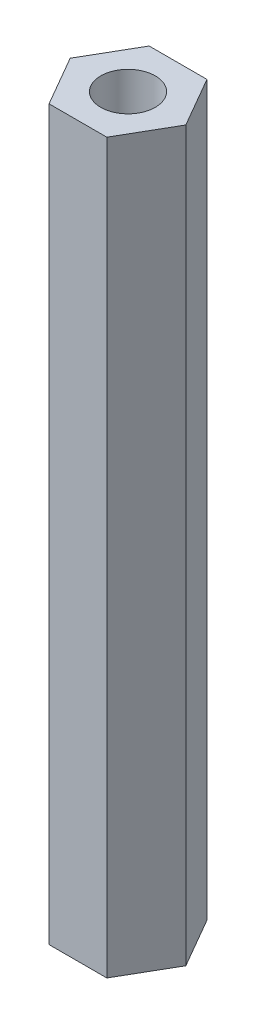
ISO-10303-21;
HEADER;
FILE_DESCRIPTION(('STEP AP214'),'2;1');
FILE_NAME('part.step','',(''),(''),'','','');
FILE_SCHEMA(('AUTOMOTIVE_DESIGN { 1 0 10303 214 1 1 1 1 }'));
ENDSEC;
DATA;
#1=APPLICATION_CONTEXT('core data for automotive mechanical design processes');
#2=APPLICATION_PROTOCOL_DEFINITION('international standard','automotive_design',2000,#1);
#3=PRODUCT_CONTEXT('',#1,'mechanical');
#4=PRODUCT('Part','Part','',(#3));
#5=PRODUCT_RELATED_PRODUCT_CATEGORY('part','',(#4));
#6=PRODUCT_DEFINITION_FORMATION('','',#4);
#7=PRODUCT_DEFINITION_CONTEXT('part definition',#1,'design');
#8=PRODUCT_DEFINITION('design','',#6,#7);
#9=PRODUCT_DEFINITION_SHAPE('','',#8);
#10=(LENGTH_UNIT() NAMED_UNIT(*) SI_UNIT(.MILLI.,.METRE.));
#11=(NAMED_UNIT(*) PLANE_ANGLE_UNIT() SI_UNIT($,.RADIAN.));
#12=(NAMED_UNIT(*) SI_UNIT($,.STERADIAN.) SOLID_ANGLE_UNIT());
#13=UNCERTAINTY_MEASURE_WITH_UNIT(LENGTH_MEASURE(1.E-05),#10,'distance_accuracy_value','');
#14=(GEOMETRIC_REPRESENTATION_CONTEXT(3) GLOBAL_UNCERTAINTY_ASSIGNED_CONTEXT((#13)) GLOBAL_UNIT_ASSIGNED_CONTEXT((#10,
#11,#12)) REPRESENTATION_CONTEXT('',''));
#15=CARTESIAN_POINT('',(0.,0.,0.));
#16=DIRECTION('',(0.,0.,1.));
#17=DIRECTION('',(1.,0.,0.));
#18=AXIS2_PLACEMENT_3D('',#15,#16,#17);
#19=CARTESIAN_POINT('',(0.,40.,0.));
#20=DIRECTION('',(0.,1.,0.));
#21=DIRECTION('',(0.,0.,1.));
#22=AXIS2_PLACEMENT_3D('',#19,#20,#21);
#23=PLANE('',#22);
#24=DIRECTION('',(0.499999999999995,0.,-0.866025403784441));
#25=VECTOR('',#24,1.);
#26=CARTESIAN_POINT('',(1.5877132402715,40.,2.74999999999997));
#27=LINE('',#26,#25);
#28=CARTESIAN_POINT('',(1.5877132402715,40.,2.74999999999997));
#29=VERTEX_POINT('',#28);
#30=CARTESIAN_POINT('',(3.17542648054293,40.,0.));
#31=VERTEX_POINT('',#30);
#32=EDGE_CURVE('E146',#29,#31,#27,.T.);
#33=ORIENTED_EDGE('',*,*,#32,.T.);
#34=DIRECTION('',(-0.500000000000001,0.,-0.866025403784438));
#35=VECTOR('',#34,1.);
#36=CARTESIAN_POINT('',(3.17542648054293,40.,0.));
#37=LINE('',#36,#35);
#38=CARTESIAN_POINT('',(1.58771324027146,40.,-2.74999999999999));
#39=VERTEX_POINT('',#38);
#40=EDGE_CURVE('E94',#31,#39,#37,.T.);
#41=ORIENTED_EDGE('',*,*,#40,.T.);
#42=DIRECTION('',(-1.,0.,0.));
#43=VECTOR('',#42,1.);
#44=CARTESIAN_POINT('',(1.58771324027146,40.,-2.74999999999999));
#45=LINE('',#44,#43);
#46=CARTESIAN_POINT('',(-1.58771324027148,40.,-2.74999999999998));
#47=VERTEX_POINT('',#46);
#48=EDGE_CURVE('E107',#39,#47,#45,.T.);
#49=ORIENTED_EDGE('',*,*,#48,.T.);
#50=DIRECTION('',(-0.499999999999995,0.,0.866025403784442));
#51=VECTOR('',#50,1.);
#52=CARTESIAN_POINT('',(-1.58771324027148,40.,-2.74999999999998));
#53=LINE('',#52,#51);
#54=CARTESIAN_POINT('',(-3.17542648054293,40.,0.));
#55=VERTEX_POINT('',#54);
#56=EDGE_CURVE('E101',#47,#55,#53,.T.);
#57=ORIENTED_EDGE('',*,*,#56,.T.);
#58=DIRECTION('',(0.500000000000007,0.,0.866025403784435));
#59=VECTOR('',#58,1.);
#60=CARTESIAN_POINT('',(-3.17542648054293,40.,0.));
#61=LINE('',#60,#59);
#62=CARTESIAN_POINT('',(-1.58771324027144,40.,2.75));
#63=VERTEX_POINT('',#62);
#64=EDGE_CURVE('E105',#55,#63,#61,.T.);
#65=ORIENTED_EDGE('',*,*,#64,.T.);
#66=DIRECTION('',(1.,0.,0.));
#67=VECTOR('',#66,1.);
#68=CARTESIAN_POINT('',(-1.58771324027144,40.,2.75));
#69=LINE('',#68,#67);
#70=EDGE_CURVE('E57',#63,#29,#69,.T.);
#71=ORIENTED_EDGE('',*,*,#70,.T.);
#72=EDGE_LOOP('',(#33,#41,#49,#57,#65,#71));
#73=FACE_BOUND('',#72,.T.);
#74=CARTESIAN_POINT('',(0.,40.,0.));
#75=DIRECTION('',(0.,1.,0.));
#76=DIRECTION('',(0.,0.,1.));
#77=AXIS2_PLACEMENT_3D('',#74,#75,#76);
#78=CIRCLE('',#77,1.5);
#79=CARTESIAN_POINT('',(0.,40.,1.5));
#80=VERTEX_POINT('',#79);
#81=EDGE_CURVE('E134',#80,#80,#78,.T.);
#82=ORIENTED_EDGE('',*,*,#81,.F.);
#83=EDGE_LOOP('',(#82));
#84=FACE_BOUND('',#83,.T.);
#85=ADVANCED_FACE('F39',(#73,#84),#23,.T.);
#86=CARTESIAN_POINT('',(0.,0.,0.));
#87=DIRECTION('',(0.,1.,0.));
#88=DIRECTION('',(0.,0.,1.));
#89=AXIS2_PLACEMENT_3D('',#86,#87,#88);
#90=PLANE('',#89);
#91=DIRECTION('',(0.499999999999995,0.,-0.866025403784441));
#92=VECTOR('',#91,1.);
#93=CARTESIAN_POINT('',(1.5877132402715,0.,2.74999999999997));
#94=LINE('',#93,#92);
#95=CARTESIAN_POINT('',(1.5877132402715,0.,2.74999999999997));
#96=VERTEX_POINT('',#95);
#97=CARTESIAN_POINT('',(3.17542648054293,0.,0.));
#98=VERTEX_POINT('',#97);
#99=EDGE_CURVE('E129',#96,#98,#94,.T.);
#100=ORIENTED_EDGE('',*,*,#99,.F.);
#101=DIRECTION('',(1.,0.,0.));
#102=VECTOR('',#101,1.);
#103=CARTESIAN_POINT('',(-1.58771324027144,0.,2.75));
#104=LINE('',#103,#102);
#105=CARTESIAN_POINT('',(-1.58771324027144,0.,2.75));
#106=VERTEX_POINT('',#105);
#107=EDGE_CURVE('E86',#106,#96,#104,.T.);
#108=ORIENTED_EDGE('',*,*,#107,.F.);
#109=DIRECTION('',(0.500000000000007,0.,0.866025403784435));
#110=VECTOR('',#109,1.);
#111=CARTESIAN_POINT('',(-3.17542648054293,0.,0.));
#112=LINE('',#111,#110);
#113=CARTESIAN_POINT('',(-3.17542648054293,0.,0.));
#114=VERTEX_POINT('',#113);
#115=EDGE_CURVE('E80',#114,#106,#112,.T.);
#116=ORIENTED_EDGE('',*,*,#115,.F.);
#117=DIRECTION('',(-0.499999999999995,0.,0.866025403784442));
#118=VECTOR('',#117,1.);
#119=CARTESIAN_POINT('',(-1.58771324027148,0.,-2.74999999999998));
#120=LINE('',#119,#118);
#121=CARTESIAN_POINT('',(-1.58771324027148,0.,-2.74999999999998));
#122=VERTEX_POINT('',#121);
#123=EDGE_CURVE('E116',#122,#114,#120,.T.);
#124=ORIENTED_EDGE('',*,*,#123,.F.);
#125=DIRECTION('',(-1.,0.,0.));
#126=VECTOR('',#125,1.);
#127=CARTESIAN_POINT('',(1.58771324027146,0.,-2.74999999999999));
#128=LINE('',#127,#126);
#129=CARTESIAN_POINT('',(1.58771324027146,0.,-2.74999999999999));
#130=VERTEX_POINT('',#129);
#131=EDGE_CURVE('E137',#130,#122,#128,.T.);
#132=ORIENTED_EDGE('',*,*,#131,.F.);
#133=DIRECTION('',(-0.500000000000001,0.,-0.866025403784438));
#134=VECTOR('',#133,1.);
#135=CARTESIAN_POINT('',(3.17542648054293,0.,0.));
#136=LINE('',#135,#134);
#137=EDGE_CURVE('E133',#98,#130,#136,.T.);
#138=ORIENTED_EDGE('',*,*,#137,.F.);
#139=EDGE_LOOP('',(#100,#108,#116,#124,#132,#138));
#140=FACE_BOUND('',#139,.T.);
#141=CARTESIAN_POINT('',(0.,0.,0.));
#142=DIRECTION('',(0.,1.,0.));
#143=DIRECTION('',(0.,0.,1.));
#144=AXIS2_PLACEMENT_3D('',#141,#142,#143);
#145=CIRCLE('',#144,1.5);
#146=CARTESIAN_POINT('',(0.,0.,1.5));
#147=VERTEX_POINT('',#146);
#148=EDGE_CURVE('E243',#147,#147,#145,.T.);
#149=ORIENTED_EDGE('',*,*,#148,.T.);
#150=EDGE_LOOP('',(#149));
#151=FACE_BOUND('',#150,.T.);
#152=ADVANCED_FACE('F159',(#140,#151),#90,.F.);
#153=CARTESIAN_POINT('',(1.5877132402715,40.,2.74999999999997));
#154=DIRECTION('',(-0.866025403784442,0.,-0.499999999999995));
#155=DIRECTION('',(-0.499999999999995,0.,0.866025403784442));
#156=AXIS2_PLACEMENT_3D('',#153,#154,#155);
#157=PLANE('',#156);
#158=ORIENTED_EDGE('',*,*,#99,.T.);
#159=DIRECTION('',(0.,-1.,0.));
#160=VECTOR('',#159,1.);
#161=CARTESIAN_POINT('',(3.17542648054293,40.,0.));
#162=LINE('',#161,#160);
#163=EDGE_CURVE('E11',#31,#98,#162,.T.);
#164=ORIENTED_EDGE('',*,*,#163,.F.);
#165=ORIENTED_EDGE('',*,*,#32,.F.);
#166=DIRECTION('',(0.,-1.,0.));
#167=VECTOR('',#166,1.);
#168=CARTESIAN_POINT('',(1.5877132402715,40.,2.74999999999997));
#169=LINE('',#168,#167);
#170=EDGE_CURVE('E125',#29,#96,#169,.T.);
#171=ORIENTED_EDGE('',*,*,#170,.T.);
#172=EDGE_LOOP('',(#158,#164,#165,#171));
#173=FACE_BOUND('',#172,.T.);
#174=ADVANCED_FACE('F41',(#173),#157,.F.);
#175=CARTESIAN_POINT('',(3.17542648054293,40.,0.));
#176=DIRECTION('',(-0.866025403784438,0.,0.500000000000001));
#177=DIRECTION('',(0.500000000000001,0.,0.866025403784438));
#178=AXIS2_PLACEMENT_3D('',#175,#176,#177);
#179=PLANE('',#178);
#180=ORIENTED_EDGE('',*,*,#137,.T.);
#181=DIRECTION('',(0.,-1.,0.));
#182=VECTOR('',#181,1.);
#183=CARTESIAN_POINT('',(1.58771324027146,40.,-2.74999999999999));
#184=LINE('',#183,#182);
#185=EDGE_CURVE('E49',#39,#130,#184,.T.);
#186=ORIENTED_EDGE('',*,*,#185,.F.);
#187=ORIENTED_EDGE('',*,*,#40,.F.);
#188=ORIENTED_EDGE('',*,*,#163,.T.);
#189=EDGE_LOOP('',(#180,#186,#187,#188));
#190=FACE_BOUND('',#189,.T.);
#191=ADVANCED_FACE('F184',(#190),#179,.F.);
#192=CARTESIAN_POINT('',(1.58771324027146,40.,-2.74999999999999));
#193=DIRECTION('',(0.,0.,1.));
#194=DIRECTION('',(1.,0.,0.));
#195=AXIS2_PLACEMENT_3D('',#192,#193,#194);
#196=PLANE('',#195);
#197=ORIENTED_EDGE('',*,*,#131,.T.);
#198=DIRECTION('',(0.,-1.,0.));
#199=VECTOR('',#198,1.);
#200=CARTESIAN_POINT('',(-1.58771324027148,40.,-2.74999999999998));
#201=LINE('',#200,#199);
#202=EDGE_CURVE('E118',#47,#122,#201,.T.);
#203=ORIENTED_EDGE('',*,*,#202,.F.);
#204=ORIENTED_EDGE('',*,*,#48,.F.);
#205=ORIENTED_EDGE('',*,*,#185,.T.);
#206=EDGE_LOOP('',(#197,#203,#204,#205));
#207=FACE_BOUND('',#206,.T.);
#208=ADVANCED_FACE('F156',(#207),#196,.F.);
#209=CARTESIAN_POINT('',(-1.58771324027148,40.,-2.74999999999998));
#210=DIRECTION('',(0.866025403784442,0.,0.499999999999995));
#211=DIRECTION('',(0.499999999999995,0.,-0.866025403784442));
#212=AXIS2_PLACEMENT_3D('',#209,#210,#211);
#213=PLANE('',#212);
#214=ORIENTED_EDGE('',*,*,#123,.T.);
#215=DIRECTION('',(0.,-1.,0.));
#216=VECTOR('',#215,1.);
#217=CARTESIAN_POINT('',(-3.17542648054293,40.,0.));
#218=LINE('',#217,#216);
#219=EDGE_CURVE('E113',#55,#114,#218,.T.);
#220=ORIENTED_EDGE('',*,*,#219,.F.);
#221=ORIENTED_EDGE('',*,*,#56,.F.);
#222=ORIENTED_EDGE('',*,*,#202,.T.);
#223=EDGE_LOOP('',(#214,#220,#221,#222));
#224=FACE_BOUND('',#223,.T.);
#225=ADVANCED_FACE('F114',(#224),#213,.F.);
#226=CARTESIAN_POINT('',(-3.17542648054293,40.,0.));
#227=DIRECTION('',(0.866025403784435,0.,-0.500000000000007));
#228=DIRECTION('',(-0.500000000000007,0.,-0.866025403784435));
#229=AXIS2_PLACEMENT_3D('',#226,#227,#228);
#230=PLANE('',#229);
#231=ORIENTED_EDGE('',*,*,#115,.T.);
#232=DIRECTION('',(0.,-1.,0.));
#233=VECTOR('',#232,1.);
#234=CARTESIAN_POINT('',(-1.58771324027144,40.,2.75));
#235=LINE('',#234,#233);
#236=EDGE_CURVE('E119',#63,#106,#235,.T.);
#237=ORIENTED_EDGE('',*,*,#236,.F.);
#238=ORIENTED_EDGE('',*,*,#64,.F.);
#239=ORIENTED_EDGE('',*,*,#219,.T.);
#240=EDGE_LOOP('',(#231,#237,#238,#239));
#241=FACE_BOUND('',#240,.T.);
#242=ADVANCED_FACE('F121',(#241),#230,.F.);
#243=CARTESIAN_POINT('',(-1.58771324027144,40.,2.75));
#244=DIRECTION('',(0.,0.,-1.));
#245=DIRECTION('',(-1.,0.,0.));
#246=AXIS2_PLACEMENT_3D('',#243,#244,#245);
#247=PLANE('',#246);
#248=ORIENTED_EDGE('',*,*,#107,.T.);
#249=ORIENTED_EDGE('',*,*,#170,.F.);
#250=ORIENTED_EDGE('',*,*,#70,.F.);
#251=ORIENTED_EDGE('',*,*,#236,.T.);
#252=EDGE_LOOP('',(#248,#249,#250,#251));
#253=FACE_BOUND('',#252,.T.);
#254=ADVANCED_FACE('F164',(#253),#247,.F.);
#255=CARTESIAN_POINT('',(0.,40.,0.));
#256=DIRECTION('',(0.,-1.,0.));
#257=DIRECTION('',(0.,0.,-1.));
#258=AXIS2_PLACEMENT_3D('',#255,#256,#257);
#259=CYLINDRICAL_SURFACE('',#258,1.5);
#260=ORIENTED_EDGE('',*,*,#81,.T.);
#261=EDGE_LOOP('',(#260));
#262=FACE_BOUND('',#261,.T.);
#263=ORIENTED_EDGE('',*,*,#148,.F.);
#264=EDGE_LOOP('',(#263));
#265=FACE_BOUND('',#264,.T.);
#266=ADVANCED_FACE('F166',(#262,#265),#259,.F.);
#267=CLOSED_SHELL('',(#85,#152,#174,#191,#208,#225,#242,#254,#266));
#268=MANIFOLD_SOLID_BREP('B2',#267);
#269=ADVANCED_BREP_SHAPE_REPRESENTATION('',(#18,#268),#14);
#270=SHAPE_DEFINITION_REPRESENTATION(#9,#269);
ENDSEC;
END-ISO-10303-21;
